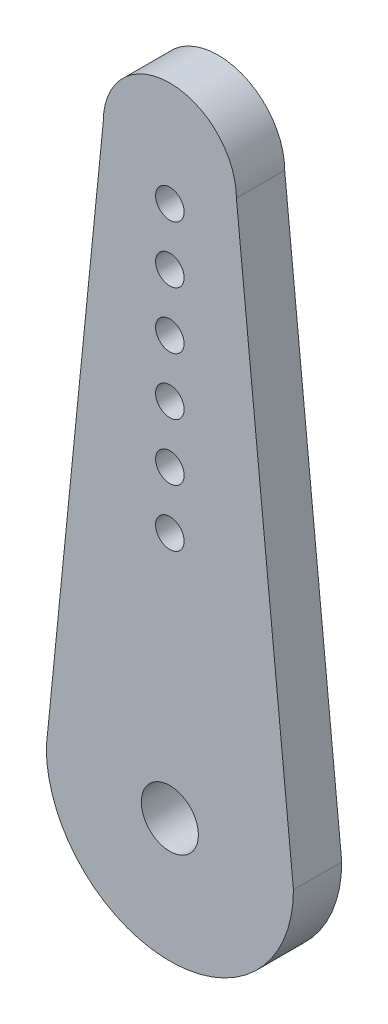
ISO-10303-21;
HEADER;
FILE_DESCRIPTION(('STEP AP214'),'2;1');
FILE_NAME('part.step','',(''),(''),'','','');
FILE_SCHEMA(('AUTOMOTIVE_DESIGN { 1 0 10303 214 1 1 1 1 }'));
ENDSEC;
DATA;
#1=APPLICATION_CONTEXT('core data for automotive mechanical design processes');
#2=APPLICATION_PROTOCOL_DEFINITION('international standard','automotive_design',2000,#1);
#3=PRODUCT_CONTEXT('',#1,'mechanical');
#4=PRODUCT('Part','Part','',(#3));
#5=PRODUCT_RELATED_PRODUCT_CATEGORY('part','',(#4));
#6=PRODUCT_DEFINITION_FORMATION('','',#4);
#7=PRODUCT_DEFINITION_CONTEXT('part definition',#1,'design');
#8=PRODUCT_DEFINITION('design','',#6,#7);
#9=PRODUCT_DEFINITION_SHAPE('','',#8);
#10=(LENGTH_UNIT() NAMED_UNIT(*) SI_UNIT(.MILLI.,.METRE.));
#11=(NAMED_UNIT(*) PLANE_ANGLE_UNIT() SI_UNIT($,.RADIAN.));
#12=(NAMED_UNIT(*) SI_UNIT($,.STERADIAN.) SOLID_ANGLE_UNIT());
#13=UNCERTAINTY_MEASURE_WITH_UNIT(LENGTH_MEASURE(1.E-05),#10,'distance_accuracy_value','');
#14=(GEOMETRIC_REPRESENTATION_CONTEXT(3) GLOBAL_UNCERTAINTY_ASSIGNED_CONTEXT((#13)) GLOBAL_UNIT_ASSIGNED_CONTEXT((#10,
#11,#12)) REPRESENTATION_CONTEXT('',''));
#15=CARTESIAN_POINT('',(0.,0.,0.));
#16=DIRECTION('',(0.,0.,1.));
#17=DIRECTION('',(1.,0.,0.));
#18=AXIS2_PLACEMENT_3D('',#15,#16,#17);
#19=CARTESIAN_POINT('',(0.,0.,2.54));
#20=DIRECTION('',(0.,0.,1.));
#21=DIRECTION('',(1.,0.,0.));
#22=AXIS2_PLACEMENT_3D('',#19,#20,#21);
#23=PLANE('',#22);
#24=CARTESIAN_POINT('',(0.,25.,2.54));
#25=DIRECTION('',(0.,0.,1.));
#26=DIRECTION('',(1.,0.,0.));
#27=AXIS2_PLACEMENT_3D('',#24,#25,#26);
#28=CIRCLE('',#27,0.750000000000001);
#29=CARTESIAN_POINT('',(0.750000000000001,25.,2.54));
#30=VERTEX_POINT('',#29);
#31=EDGE_CURVE('E138',#30,#30,#28,.T.);
#32=ORIENTED_EDGE('',*,*,#31,.F.);
#33=EDGE_LOOP('',(#32));
#34=FACE_BOUND('',#33,.T.);
#35=CARTESIAN_POINT('',(0.,19.,2.54));
#36=DIRECTION('',(0.,0.,1.));
#37=DIRECTION('',(1.,0.,0.));
#38=AXIS2_PLACEMENT_3D('',#35,#36,#37);
#39=CIRCLE('',#38,0.750000000000001);
#40=CARTESIAN_POINT('',(0.750000000000001,19.,2.54));
#41=VERTEX_POINT('',#40);
#42=EDGE_CURVE('E126',#41,#41,#39,.T.);
#43=ORIENTED_EDGE('',*,*,#42,.F.);
#44=EDGE_LOOP('',(#43));
#45=FACE_BOUND('',#44,.T.);
#46=CARTESIAN_POINT('',(0.,13.,2.54));
#47=DIRECTION('',(0.,0.,1.));
#48=DIRECTION('',(1.,0.,0.));
#49=AXIS2_PLACEMENT_3D('',#46,#47,#48);
#50=CIRCLE('',#49,0.75);
#51=CARTESIAN_POINT('',(0.75,13.,2.54));
#52=VERTEX_POINT('',#51);
#53=EDGE_CURVE('E114',#52,#52,#50,.T.);
#54=ORIENTED_EDGE('',*,*,#53,.F.);
#55=EDGE_LOOP('',(#54));
#56=FACE_BOUND('',#55,.T.);
#57=CARTESIAN_POINT('',(0.,0.,2.54));
#58=DIRECTION('',(0.,0.,1.));
#59=DIRECTION('',(1.,0.,0.));
#60=AXIS2_PLACEMENT_3D('',#57,#58,#59);
#61=CIRCLE('',#60,6.5);
#62=CARTESIAN_POINT('',(-6.5,0.,2.54));
#63=VERTEX_POINT('',#62);
#64=CARTESIAN_POINT('',(6.5,0.,2.54));
#65=VERTEX_POINT('',#64);
#66=EDGE_CURVE('E84',#63,#65,#61,.T.);
#67=ORIENTED_EDGE('',*,*,#66,.T.);
#68=DIRECTION('',(-0.0995037190209989,0.995037190209989,0.));
#69=VECTOR('',#68,1.);
#70=CARTESIAN_POINT('',(3.5,30.,2.54));
#71=LINE('',#70,#69);
#72=CARTESIAN_POINT('',(3.5,30.,2.54));
#73=VERTEX_POINT('',#72);
#74=EDGE_CURVE('E79',#65,#73,#71,.T.);
#75=ORIENTED_EDGE('',*,*,#74,.T.);
#76=CARTESIAN_POINT('',(0.,30.,2.54));
#77=DIRECTION('',(0.,0.,1.));
#78=DIRECTION('',(-1.,0.,0.));
#79=AXIS2_PLACEMENT_3D('',#76,#77,#78);
#80=CIRCLE('',#79,3.5);
#81=CARTESIAN_POINT('',(-3.5,30.,2.54));
#82=VERTEX_POINT('',#81);
#83=EDGE_CURVE('E82',#73,#82,#80,.T.);
#84=ORIENTED_EDGE('',*,*,#83,.T.);
#85=DIRECTION('',(-0.0995037190209989,-0.995037190209989,0.));
#86=VECTOR('',#85,1.);
#87=CARTESIAN_POINT('',(-3.5,30.,2.54));
#88=LINE('',#87,#86);
#89=EDGE_CURVE('E49',#82,#63,#88,.T.);
#90=ORIENTED_EDGE('',*,*,#89,.T.);
#91=EDGE_LOOP('',(#67,#75,#84,#90));
#92=FACE_BOUND('',#91,.T.);
#93=CARTESIAN_POINT('',(0.,0.,2.54));
#94=DIRECTION('',(0.,0.,1.));
#95=DIRECTION('',(1.,0.,0.));
#96=AXIS2_PLACEMENT_3D('',#93,#94,#95);
#97=CIRCLE('',#96,1.5);
#98=CARTESIAN_POINT('',(1.5,0.,2.54));
#99=VERTEX_POINT('',#98);
#100=EDGE_CURVE('E99',#99,#99,#97,.T.);
#101=ORIENTED_EDGE('',*,*,#100,.F.);
#102=EDGE_LOOP('',(#101));
#103=FACE_BOUND('',#102,.T.);
#104=CARTESIAN_POINT('',(0.,16.,2.54));
#105=DIRECTION('',(0.,0.,1.));
#106=DIRECTION('',(1.,0.,0.));
#107=AXIS2_PLACEMENT_3D('',#104,#105,#106);
#108=CIRCLE('',#107,0.750000000000001);
#109=CARTESIAN_POINT('',(0.750000000000001,16.,2.54));
#110=VERTEX_POINT('',#109);
#111=EDGE_CURVE('E120',#110,#110,#108,.T.);
#112=ORIENTED_EDGE('',*,*,#111,.F.);
#113=EDGE_LOOP('',(#112));
#114=FACE_BOUND('',#113,.T.);
#115=CARTESIAN_POINT('',(0.,22.,2.54));
#116=DIRECTION('',(0.,0.,1.));
#117=DIRECTION('',(1.,0.,0.));
#118=AXIS2_PLACEMENT_3D('',#115,#116,#117);
#119=CIRCLE('',#118,0.750000000000001);
#120=CARTESIAN_POINT('',(0.750000000000001,22.,2.54));
#121=VERTEX_POINT('',#120);
#122=EDGE_CURVE('E132',#121,#121,#119,.T.);
#123=ORIENTED_EDGE('',*,*,#122,.F.);
#124=EDGE_LOOP('',(#123));
#125=FACE_BOUND('',#124,.T.);
#126=CARTESIAN_POINT('',(0.,28.,2.54));
#127=DIRECTION('',(0.,0.,1.));
#128=DIRECTION('',(1.,0.,0.));
#129=AXIS2_PLACEMENT_3D('',#126,#127,#128);
#130=CIRCLE('',#129,0.750000000000001);
#131=CARTESIAN_POINT('',(0.750000000000001,28.,2.54));
#132=VERTEX_POINT('',#131);
#133=EDGE_CURVE('E144',#132,#132,#130,.T.);
#134=ORIENTED_EDGE('',*,*,#133,.F.);
#135=EDGE_LOOP('',(#134));
#136=FACE_BOUND('',#135,.T.);
#137=ADVANCED_FACE('F32',(#34,#45,#56,#92,#103,#114,#125,#136),#23,.T.);
#138=CARTESIAN_POINT('',(0.,0.,0.));
#139=DIRECTION('',(0.,0.,1.));
#140=DIRECTION('',(1.,0.,0.));
#141=AXIS2_PLACEMENT_3D('',#138,#139,#140);
#142=PLANE('',#141);
#143=CARTESIAN_POINT('',(0.,25.,0.));
#144=DIRECTION('',(0.,0.,1.));
#145=DIRECTION('',(1.,0.,0.));
#146=AXIS2_PLACEMENT_3D('',#143,#144,#145);
#147=CIRCLE('',#146,0.750000000000001);
#148=CARTESIAN_POINT('',(0.750000000000001,25.,0.));
#149=VERTEX_POINT('',#148);
#150=EDGE_CURVE('E141',#149,#149,#147,.T.);
#151=ORIENTED_EDGE('',*,*,#150,.T.);
#152=EDGE_LOOP('',(#151));
#153=FACE_BOUND('',#152,.T.);
#154=CARTESIAN_POINT('',(0.,19.,0.));
#155=DIRECTION('',(0.,0.,1.));
#156=DIRECTION('',(1.,0.,0.));
#157=AXIS2_PLACEMENT_3D('',#154,#155,#156);
#158=CIRCLE('',#157,0.750000000000001);
#159=CARTESIAN_POINT('',(0.750000000000001,19.,0.));
#160=VERTEX_POINT('',#159);
#161=EDGE_CURVE('E129',#160,#160,#158,.T.);
#162=ORIENTED_EDGE('',*,*,#161,.T.);
#163=EDGE_LOOP('',(#162));
#164=FACE_BOUND('',#163,.T.);
#165=CARTESIAN_POINT('',(0.,13.,0.));
#166=DIRECTION('',(0.,0.,1.));
#167=DIRECTION('',(1.,0.,0.));
#168=AXIS2_PLACEMENT_3D('',#165,#166,#167);
#169=CIRCLE('',#168,0.75);
#170=CARTESIAN_POINT('',(0.75,13.,0.));
#171=VERTEX_POINT('',#170);
#172=EDGE_CURVE('E117',#171,#171,#169,.T.);
#173=ORIENTED_EDGE('',*,*,#172,.T.);
#174=EDGE_LOOP('',(#173));
#175=FACE_BOUND('',#174,.T.);
#176=CARTESIAN_POINT('',(0.,0.,0.));
#177=DIRECTION('',(0.,0.,1.));
#178=DIRECTION('',(1.,0.,0.));
#179=AXIS2_PLACEMENT_3D('',#176,#177,#178);
#180=CIRCLE('',#179,6.5);
#181=CARTESIAN_POINT('',(-6.5,0.,0.));
#182=VERTEX_POINT('',#181);
#183=CARTESIAN_POINT('',(6.5,0.,0.));
#184=VERTEX_POINT('',#183);
#185=EDGE_CURVE('E96',#182,#184,#180,.T.);
#186=ORIENTED_EDGE('',*,*,#185,.F.);
#187=DIRECTION('',(-0.0995037190209989,-0.995037190209989,0.));
#188=VECTOR('',#187,1.);
#189=CARTESIAN_POINT('',(-3.5,30.,0.));
#190=LINE('',#189,#188);
#191=CARTESIAN_POINT('',(-3.5,30.,0.));
#192=VERTEX_POINT('',#191);
#193=EDGE_CURVE('E72',#192,#182,#190,.T.);
#194=ORIENTED_EDGE('',*,*,#193,.F.);
#195=CARTESIAN_POINT('',(0.,30.,0.));
#196=DIRECTION('',(0.,0.,1.));
#197=DIRECTION('',(-1.,0.,0.));
#198=AXIS2_PLACEMENT_3D('',#195,#196,#197);
#199=CIRCLE('',#198,3.5);
#200=CARTESIAN_POINT('',(3.5,30.,0.));
#201=VERTEX_POINT('',#200);
#202=EDGE_CURVE('E66',#201,#192,#199,.T.);
#203=ORIENTED_EDGE('',*,*,#202,.F.);
#204=DIRECTION('',(-0.0995037190209989,0.995037190209989,0.));
#205=VECTOR('',#204,1.);
#206=CARTESIAN_POINT('',(3.5,30.,0.));
#207=LINE('',#206,#205);
#208=EDGE_CURVE('E88',#184,#201,#207,.T.);
#209=ORIENTED_EDGE('',*,*,#208,.F.);
#210=EDGE_LOOP('',(#186,#194,#203,#209));
#211=FACE_BOUND('',#210,.T.);
#212=CARTESIAN_POINT('',(0.,0.,0.));
#213=DIRECTION('',(0.,0.,1.));
#214=DIRECTION('',(1.,0.,0.));
#215=AXIS2_PLACEMENT_3D('',#212,#213,#214);
#216=CIRCLE('',#215,1.5);
#217=CARTESIAN_POINT('',(1.5,0.,0.));
#218=VERTEX_POINT('',#217);
#219=EDGE_CURVE('E111',#218,#218,#216,.T.);
#220=ORIENTED_EDGE('',*,*,#219,.T.);
#221=EDGE_LOOP('',(#220));
#222=FACE_BOUND('',#221,.T.);
#223=CARTESIAN_POINT('',(0.,16.,0.));
#224=DIRECTION('',(0.,0.,1.));
#225=DIRECTION('',(1.,0.,0.));
#226=AXIS2_PLACEMENT_3D('',#223,#224,#225);
#227=CIRCLE('',#226,0.750000000000001);
#228=CARTESIAN_POINT('',(0.750000000000001,16.,0.));
#229=VERTEX_POINT('',#228);
#230=EDGE_CURVE('E123',#229,#229,#227,.T.);
#231=ORIENTED_EDGE('',*,*,#230,.T.);
#232=EDGE_LOOP('',(#231));
#233=FACE_BOUND('',#232,.T.);
#234=CARTESIAN_POINT('',(0.,22.,0.));
#235=DIRECTION('',(0.,0.,1.));
#236=DIRECTION('',(1.,0.,0.));
#237=AXIS2_PLACEMENT_3D('',#234,#235,#236);
#238=CIRCLE('',#237,0.750000000000001);
#239=CARTESIAN_POINT('',(0.750000000000001,22.,0.));
#240=VERTEX_POINT('',#239);
#241=EDGE_CURVE('E135',#240,#240,#238,.T.);
#242=ORIENTED_EDGE('',*,*,#241,.T.);
#243=EDGE_LOOP('',(#242));
#244=FACE_BOUND('',#243,.T.);
#245=CARTESIAN_POINT('',(0.,28.,0.));
#246=DIRECTION('',(0.,0.,1.));
#247=DIRECTION('',(1.,0.,0.));
#248=AXIS2_PLACEMENT_3D('',#245,#246,#247);
#249=CIRCLE('',#248,0.750000000000001);
#250=CARTESIAN_POINT('',(0.750000000000001,28.,0.));
#251=VERTEX_POINT('',#250);
#252=EDGE_CURVE('E147',#251,#251,#249,.T.);
#253=ORIENTED_EDGE('',*,*,#252,.T.);
#254=EDGE_LOOP('',(#253));
#255=FACE_BOUND('',#254,.T.);
#256=ADVANCED_FACE('F107',(#153,#164,#175,#211,#222,#233,#244,#255),#142,.F.);
#257=CARTESIAN_POINT('',(0.,0.,2.54));
#258=DIRECTION('',(0.,0.,-1.));
#259=DIRECTION('',(-1.,0.,0.));
#260=AXIS2_PLACEMENT_3D('',#257,#258,#259);
#261=CYLINDRICAL_SURFACE('',#260,6.5);
#262=ORIENTED_EDGE('',*,*,#185,.T.);
#263=DIRECTION('',(0.,0.,-1.));
#264=VECTOR('',#263,1.);
#265=CARTESIAN_POINT('',(6.5,0.,2.54));
#266=LINE('',#265,#264);
#267=EDGE_CURVE('E11',#65,#184,#266,.T.);
#268=ORIENTED_EDGE('',*,*,#267,.F.);
#269=ORIENTED_EDGE('',*,*,#66,.F.);
#270=DIRECTION('',(0.,0.,-1.));
#271=VECTOR('',#270,1.);
#272=CARTESIAN_POINT('',(-6.5,0.,2.54));
#273=LINE('',#272,#271);
#274=EDGE_CURVE('E92',#63,#182,#273,.T.);
#275=ORIENTED_EDGE('',*,*,#274,.T.);
#276=EDGE_LOOP('',(#262,#268,#269,#275));
#277=FACE_BOUND('',#276,.T.);
#278=ADVANCED_FACE('F34',(#277),#261,.T.);
#279=CARTESIAN_POINT('',(3.5,30.,2.54));
#280=DIRECTION('',(-0.995037190209989,-0.0995037190209989,0.));
#281=DIRECTION('',(0.0995037190209989,-0.995037190209989,0.));
#282=AXIS2_PLACEMENT_3D('',#279,#280,#281);
#283=PLANE('',#282);
#284=ORIENTED_EDGE('',*,*,#208,.T.);
#285=DIRECTION('',(0.,0.,-1.));
#286=VECTOR('',#285,1.);
#287=CARTESIAN_POINT('',(3.5,30.,2.54));
#288=LINE('',#287,#286);
#289=EDGE_CURVE('E41',#73,#201,#288,.T.);
#290=ORIENTED_EDGE('',*,*,#289,.F.);
#291=ORIENTED_EDGE('',*,*,#74,.F.);
#292=ORIENTED_EDGE('',*,*,#267,.T.);
#293=EDGE_LOOP('',(#284,#290,#291,#292));
#294=FACE_BOUND('',#293,.T.);
#295=ADVANCED_FACE('F87',(#294),#283,.F.);
#296=CARTESIAN_POINT('',(0.,30.,2.54));
#297=DIRECTION('',(0.,0.,-1.));
#298=DIRECTION('',(-1.,0.,0.));
#299=AXIS2_PLACEMENT_3D('',#296,#297,#298);
#300=CYLINDRICAL_SURFACE('',#299,3.5);
#301=ORIENTED_EDGE('',*,*,#202,.T.);
#302=DIRECTION('',(0.,0.,-1.));
#303=VECTOR('',#302,1.);
#304=CARTESIAN_POINT('',(-3.5,30.,2.54));
#305=LINE('',#304,#303);
#306=EDGE_CURVE('E89',#82,#192,#305,.T.);
#307=ORIENTED_EDGE('',*,*,#306,.F.);
#308=ORIENTED_EDGE('',*,*,#83,.F.);
#309=ORIENTED_EDGE('',*,*,#289,.T.);
#310=EDGE_LOOP('',(#301,#307,#308,#309));
#311=FACE_BOUND('',#310,.T.);
#312=ADVANCED_FACE('F90',(#311),#300,.T.);
#313=CARTESIAN_POINT('',(-3.5,30.,2.54));
#314=DIRECTION('',(0.995037190209989,-0.0995037190209989,0.));
#315=DIRECTION('',(0.0995037190209989,0.995037190209989,0.));
#316=AXIS2_PLACEMENT_3D('',#313,#314,#315);
#317=PLANE('',#316);
#318=ORIENTED_EDGE('',*,*,#193,.T.);
#319=ORIENTED_EDGE('',*,*,#274,.F.);
#320=ORIENTED_EDGE('',*,*,#89,.F.);
#321=ORIENTED_EDGE('',*,*,#306,.T.);
#322=EDGE_LOOP('',(#318,#319,#320,#321));
#323=FACE_BOUND('',#322,.T.);
#324=ADVANCED_FACE('F104',(#323),#317,.F.);
#325=CARTESIAN_POINT('',(0.,0.,2.54));
#326=DIRECTION('',(0.,0.,-1.));
#327=DIRECTION('',(-1.,0.,0.));
#328=AXIS2_PLACEMENT_3D('',#325,#326,#327);
#329=CYLINDRICAL_SURFACE('',#328,1.5);
#330=ORIENTED_EDGE('',*,*,#100,.T.);
#331=EDGE_LOOP('',(#330));
#332=FACE_BOUND('',#331,.T.);
#333=ORIENTED_EDGE('',*,*,#219,.F.);
#334=EDGE_LOOP('',(#333));
#335=FACE_BOUND('',#334,.T.);
#336=ADVANCED_FACE('F167',(#332,#335),#329,.F.);
#337=CARTESIAN_POINT('',(0.,13.,2.54));
#338=DIRECTION('',(0.,0.,-1.));
#339=DIRECTION('',(-1.,0.,0.));
#340=AXIS2_PLACEMENT_3D('',#337,#338,#339);
#341=CYLINDRICAL_SURFACE('',#340,0.75);
#342=ORIENTED_EDGE('',*,*,#53,.T.);
#343=EDGE_LOOP('',(#342));
#344=FACE_BOUND('',#343,.T.);
#345=ORIENTED_EDGE('',*,*,#172,.F.);
#346=EDGE_LOOP('',(#345));
#347=FACE_BOUND('',#346,.T.);
#348=ADVANCED_FACE('F213',(#344,#347),#341,.F.);
#349=CARTESIAN_POINT('',(0.,16.,2.54));
#350=DIRECTION('',(0.,0.,-1.));
#351=DIRECTION('',(-1.,0.,0.));
#352=AXIS2_PLACEMENT_3D('',#349,#350,#351);
#353=CYLINDRICAL_SURFACE('',#352,0.750000000000001);
#354=ORIENTED_EDGE('',*,*,#111,.T.);
#355=EDGE_LOOP('',(#354));
#356=FACE_BOUND('',#355,.T.);
#357=ORIENTED_EDGE('',*,*,#230,.F.);
#358=EDGE_LOOP('',(#357));
#359=FACE_BOUND('',#358,.T.);
#360=ADVANCED_FACE('F221',(#356,#359),#353,.F.);
#361=CARTESIAN_POINT('',(0.,19.,2.54));
#362=DIRECTION('',(0.,0.,-1.));
#363=DIRECTION('',(-1.,0.,0.));
#364=AXIS2_PLACEMENT_3D('',#361,#362,#363);
#365=CYLINDRICAL_SURFACE('',#364,0.750000000000001);
#366=ORIENTED_EDGE('',*,*,#42,.T.);
#367=EDGE_LOOP('',(#366));
#368=FACE_BOUND('',#367,.T.);
#369=ORIENTED_EDGE('',*,*,#161,.F.);
#370=EDGE_LOOP('',(#369));
#371=FACE_BOUND('',#370,.T.);
#372=ADVANCED_FACE('F229',(#368,#371),#365,.F.);
#373=CARTESIAN_POINT('',(0.,22.,2.54));
#374=DIRECTION('',(0.,0.,-1.));
#375=DIRECTION('',(-1.,0.,0.));
#376=AXIS2_PLACEMENT_3D('',#373,#374,#375);
#377=CYLINDRICAL_SURFACE('',#376,0.750000000000001);
#378=ORIENTED_EDGE('',*,*,#122,.T.);
#379=EDGE_LOOP('',(#378));
#380=FACE_BOUND('',#379,.T.);
#381=ORIENTED_EDGE('',*,*,#241,.F.);
#382=EDGE_LOOP('',(#381));
#383=FACE_BOUND('',#382,.T.);
#384=ADVANCED_FACE('F238',(#380,#383),#377,.F.);
#385=CARTESIAN_POINT('',(0.,25.,2.54));
#386=DIRECTION('',(0.,0.,-1.));
#387=DIRECTION('',(-1.,0.,0.));
#388=AXIS2_PLACEMENT_3D('',#385,#386,#387);
#389=CYLINDRICAL_SURFACE('',#388,0.750000000000001);
#390=ORIENTED_EDGE('',*,*,#31,.T.);
#391=EDGE_LOOP('',(#390));
#392=FACE_BOUND('',#391,.T.);
#393=ORIENTED_EDGE('',*,*,#150,.F.);
#394=EDGE_LOOP('',(#393));
#395=FACE_BOUND('',#394,.T.);
#396=ADVANCED_FACE('F247',(#392,#395),#389,.F.);
#397=CARTESIAN_POINT('',(0.,28.,2.54));
#398=DIRECTION('',(0.,0.,-1.));
#399=DIRECTION('',(-1.,0.,0.));
#400=AXIS2_PLACEMENT_3D('',#397,#398,#399);
#401=CYLINDRICAL_SURFACE('',#400,0.750000000000001);
#402=ORIENTED_EDGE('',*,*,#133,.T.);
#403=EDGE_LOOP('',(#402));
#404=FACE_BOUND('',#403,.T.);
#405=ORIENTED_EDGE('',*,*,#252,.F.);
#406=EDGE_LOOP('',(#405));
#407=FACE_BOUND('',#406,.T.);
#408=ADVANCED_FACE('F153',(#404,#407),#401,.F.);
#409=CLOSED_SHELL('',(#137,#256,#278,#295,#312,#324,#336,#348,#360,#372,#384,#396,#408));
#410=MANIFOLD_SOLID_BREP('B2',#409);
#411=ADVANCED_BREP_SHAPE_REPRESENTATION('',(#18,#410),#14);
#412=SHAPE_DEFINITION_REPRESENTATION(#9,#411);
ENDSEC;
END-ISO-10303-21;
